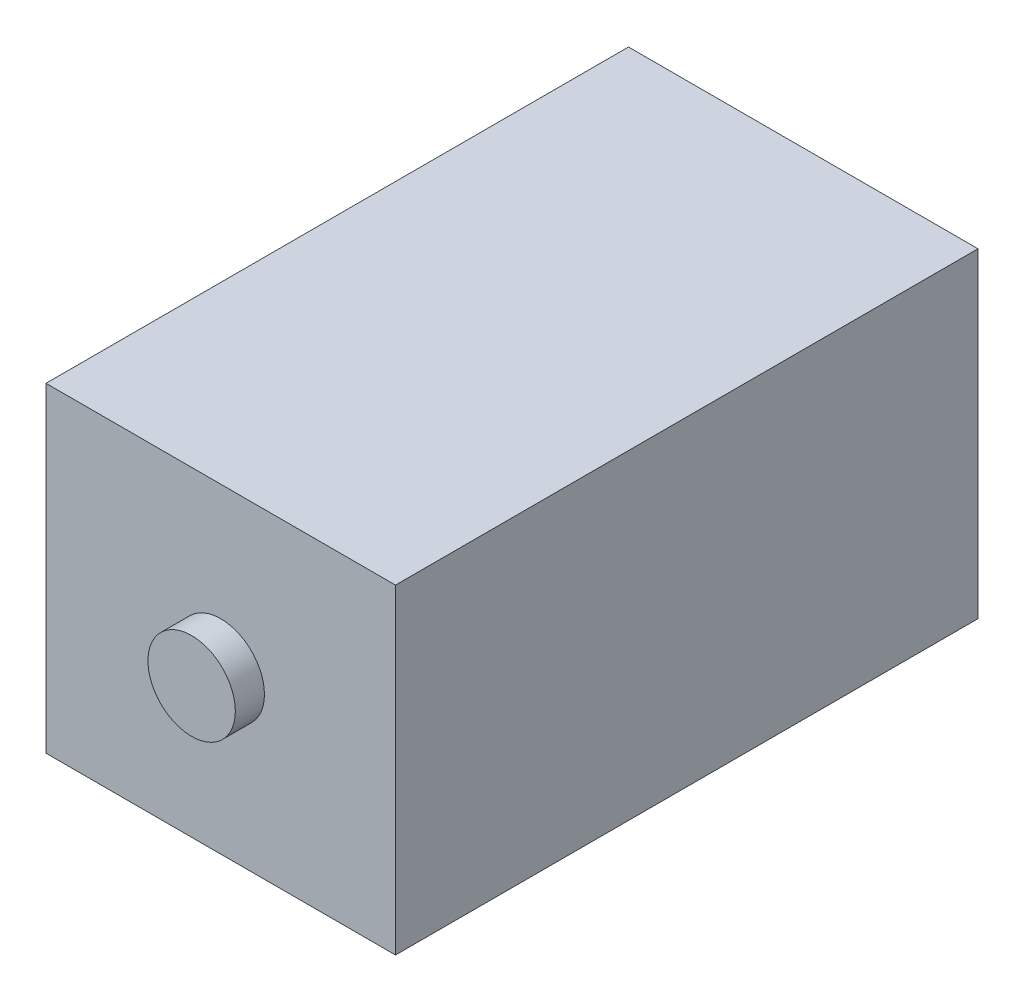
ISO-10303-21;
HEADER;
FILE_DESCRIPTION(('STEP AP214'),'2;1');
FILE_NAME('part.step','',(''),(''),'','','');
FILE_SCHEMA(('AUTOMOTIVE_DESIGN { 1 0 10303 214 1 1 1 1 }'));
ENDSEC;
DATA;
#1=APPLICATION_CONTEXT('core data for automotive mechanical design processes');
#2=APPLICATION_PROTOCOL_DEFINITION('international standard','automotive_design',2000,#1);
#3=PRODUCT_CONTEXT('',#1,'mechanical');
#4=PRODUCT('Part','Part','',(#3));
#5=PRODUCT_RELATED_PRODUCT_CATEGORY('part','',(#4));
#6=PRODUCT_DEFINITION_FORMATION('','',#4);
#7=PRODUCT_DEFINITION_CONTEXT('part definition',#1,'design');
#8=PRODUCT_DEFINITION('design','',#6,#7);
#9=PRODUCT_DEFINITION_SHAPE('','',#8);
#10=(LENGTH_UNIT() NAMED_UNIT(*) SI_UNIT(.MILLI.,.METRE.));
#11=(NAMED_UNIT(*) PLANE_ANGLE_UNIT() SI_UNIT($,.RADIAN.));
#12=(NAMED_UNIT(*) SI_UNIT($,.STERADIAN.) SOLID_ANGLE_UNIT());
#13=UNCERTAINTY_MEASURE_WITH_UNIT(LENGTH_MEASURE(1.E-05),#10,'distance_accuracy_value','');
#14=(GEOMETRIC_REPRESENTATION_CONTEXT(3) GLOBAL_UNCERTAINTY_ASSIGNED_CONTEXT((#13)) GLOBAL_UNIT_ASSIGNED_CONTEXT((#10,
#11,#12)) REPRESENTATION_CONTEXT('',''));
#15=CARTESIAN_POINT('',(0.,0.,0.));
#16=DIRECTION('',(0.,0.,1.));
#17=DIRECTION('',(1.,0.,0.));
#18=AXIS2_PLACEMENT_3D('',#15,#16,#17);
#19=CARTESIAN_POINT('',(-6.,5.5,20.));
#20=DIRECTION('',(1.,0.,0.));
#21=DIRECTION('',(0.,1.,0.));
#22=AXIS2_PLACEMENT_3D('',#19,#20,#21);
#23=PLANE('',#22);
#24=DIRECTION('',(0.,-1.,0.));
#25=VECTOR('',#24,1.);
#26=CARTESIAN_POINT('',(-6.,5.5,0.));
#27=LINE('',#26,#25);
#28=CARTESIAN_POINT('',(-6.,5.5,0.));
#29=VERTEX_POINT('',#28);
#30=CARTESIAN_POINT('',(-6.,-5.5,0.));
#31=VERTEX_POINT('',#30);
#32=EDGE_CURVE('E99',#29,#31,#27,.T.);
#33=ORIENTED_EDGE('',*,*,#32,.T.);
#34=DIRECTION('',(0.,0.,-1.));
#35=VECTOR('',#34,1.);
#36=CARTESIAN_POINT('',(-6.,-5.5,20.));
#37=LINE('',#36,#35);
#38=CARTESIAN_POINT('',(-6.,-5.5,20.));
#39=VERTEX_POINT('',#38);
#40=EDGE_CURVE('E36',#39,#31,#37,.T.);
#41=ORIENTED_EDGE('',*,*,#40,.F.);
#42=DIRECTION('',(0.,-1.,0.));
#43=VECTOR('',#42,1.);
#44=CARTESIAN_POINT('',(-6.,5.5,20.));
#45=LINE('',#44,#43);
#46=CARTESIAN_POINT('',(-6.,5.5,20.));
#47=VERTEX_POINT('',#46);
#48=EDGE_CURVE('E86',#47,#39,#45,.T.);
#49=ORIENTED_EDGE('',*,*,#48,.F.);
#50=DIRECTION('',(0.,0.,-1.));
#51=VECTOR('',#50,1.);
#52=CARTESIAN_POINT('',(-6.,5.5,20.));
#53=LINE('',#52,#51);
#54=EDGE_CURVE('E95',#47,#29,#53,.T.);
#55=ORIENTED_EDGE('',*,*,#54,.T.);
#56=EDGE_LOOP('',(#33,#41,#49,#55));
#57=FACE_BOUND('',#56,.T.);
#58=ADVANCED_FACE('F33',(#57),#23,.F.);
#59=CARTESIAN_POINT('',(6.,-5.5,20.));
#60=DIRECTION('',(0.,1.,0.));
#61=DIRECTION('',(-1.,0.,0.));
#62=AXIS2_PLACEMENT_3D('',#59,#60,#61);
#63=PLANE('',#62);
#64=DIRECTION('',(1.,0.,0.));
#65=VECTOR('',#64,1.);
#66=CARTESIAN_POINT('',(6.,-5.5,0.));
#67=LINE('',#66,#65);
#68=CARTESIAN_POINT('',(6.,-5.5,0.));
#69=VERTEX_POINT('',#68);
#70=EDGE_CURVE('E91',#31,#69,#67,.T.);
#71=ORIENTED_EDGE('',*,*,#70,.T.);
#72=DIRECTION('',(0.,0.,-1.));
#73=VECTOR('',#72,1.);
#74=CARTESIAN_POINT('',(6.,-5.5,20.));
#75=LINE('',#74,#73);
#76=CARTESIAN_POINT('',(6.,-5.5,20.));
#77=VERTEX_POINT('',#76);
#78=EDGE_CURVE('E89',#77,#69,#75,.T.);
#79=ORIENTED_EDGE('',*,*,#78,.F.);
#80=DIRECTION('',(1.,0.,0.));
#81=VECTOR('',#80,1.);
#82=CARTESIAN_POINT('',(6.,-5.5,20.));
#83=LINE('',#82,#81);
#84=EDGE_CURVE('E81',#39,#77,#83,.T.);
#85=ORIENTED_EDGE('',*,*,#84,.F.);
#86=ORIENTED_EDGE('',*,*,#40,.T.);
#87=EDGE_LOOP('',(#71,#79,#85,#86));
#88=FACE_BOUND('',#87,.T.);
#89=ADVANCED_FACE('F90',(#88),#63,.F.);
#90=CARTESIAN_POINT('',(6.,5.5,20.));
#91=DIRECTION('',(-1.,0.,0.));
#92=DIRECTION('',(0.,-1.,0.));
#93=AXIS2_PLACEMENT_3D('',#90,#91,#92);
#94=PLANE('',#93);
#95=DIRECTION('',(0.,1.,0.));
#96=VECTOR('',#95,1.);
#97=CARTESIAN_POINT('',(6.,5.5,0.));
#98=LINE('',#97,#96);
#99=CARTESIAN_POINT('',(6.,5.5,0.));
#100=VERTEX_POINT('',#99);
#101=EDGE_CURVE('E67',#69,#100,#98,.T.);
#102=ORIENTED_EDGE('',*,*,#101,.T.);
#103=DIRECTION('',(0.,0.,-1.));
#104=VECTOR('',#103,1.);
#105=CARTESIAN_POINT('',(6.,5.5,20.));
#106=LINE('',#105,#104);
#107=CARTESIAN_POINT('',(6.,5.5,20.));
#108=VERTEX_POINT('',#107);
#109=EDGE_CURVE('E92',#108,#100,#106,.T.);
#110=ORIENTED_EDGE('',*,*,#109,.F.);
#111=DIRECTION('',(0.,1.,0.));
#112=VECTOR('',#111,1.);
#113=CARTESIAN_POINT('',(6.,5.5,20.));
#114=LINE('',#113,#112);
#115=EDGE_CURVE('E84',#77,#108,#114,.T.);
#116=ORIENTED_EDGE('',*,*,#115,.F.);
#117=ORIENTED_EDGE('',*,*,#78,.T.);
#118=EDGE_LOOP('',(#102,#110,#116,#117));
#119=FACE_BOUND('',#118,.T.);
#120=ADVANCED_FACE('F93',(#119),#94,.F.);
#121=CARTESIAN_POINT('',(6.,5.5,20.));
#122=DIRECTION('',(0.,-1.,0.));
#123=DIRECTION('',(1.,0.,0.));
#124=AXIS2_PLACEMENT_3D('',#121,#122,#123);
#125=PLANE('',#124);
#126=DIRECTION('',(-1.,0.,0.));
#127=VECTOR('',#126,1.);
#128=CARTESIAN_POINT('',(6.,5.5,0.));
#129=LINE('',#128,#127);
#130=EDGE_CURVE('E73',#100,#29,#129,.T.);
#131=ORIENTED_EDGE('',*,*,#130,.T.);
#132=ORIENTED_EDGE('',*,*,#54,.F.);
#133=DIRECTION('',(-1.,0.,0.));
#134=VECTOR('',#133,1.);
#135=CARTESIAN_POINT('',(6.,5.5,20.));
#136=LINE('',#135,#134);
#137=EDGE_CURVE('E50',#108,#47,#136,.T.);
#138=ORIENTED_EDGE('',*,*,#137,.F.);
#139=ORIENTED_EDGE('',*,*,#109,.T.);
#140=EDGE_LOOP('',(#131,#132,#138,#139));
#141=FACE_BOUND('',#140,.T.);
#142=ADVANCED_FACE('F107',(#141),#125,.F.);
#143=CARTESIAN_POINT('',(0.,0.,20.));
#144=DIRECTION('',(0.,0.,-1.));
#145=DIRECTION('',(-1.,0.,0.));
#146=AXIS2_PLACEMENT_3D('',#143,#144,#145);
#147=PLANE('',#146);
#148=CARTESIAN_POINT('',(0.,0.,20.));
#149=DIRECTION('',(0.,0.,1.));
#150=DIRECTION('',(1.,0.,0.));
#151=AXIS2_PLACEMENT_3D('',#148,#149,#150);
#152=CIRCLE('',#151,1.5);
#153=CARTESIAN_POINT('',(1.5,0.,20.));
#154=VERTEX_POINT('',#153);
#155=EDGE_CURVE('E11',#154,#154,#152,.T.);
#156=ORIENTED_EDGE('',*,*,#155,.F.);
#157=EDGE_LOOP('',(#156));
#158=FACE_BOUND('',#157,.T.);
#159=ORIENTED_EDGE('',*,*,#48,.T.);
#160=ORIENTED_EDGE('',*,*,#84,.T.);
#161=ORIENTED_EDGE('',*,*,#115,.T.);
#162=ORIENTED_EDGE('',*,*,#137,.T.);
#163=EDGE_LOOP('',(#159,#160,#161,#162));
#164=FACE_BOUND('',#163,.T.);
#165=ADVANCED_FACE('F82',(#158,#164),#147,.F.);
#166=CARTESIAN_POINT('',(0.,0.,0.));
#167=DIRECTION('',(0.,0.,-1.));
#168=DIRECTION('',(-1.,0.,0.));
#169=AXIS2_PLACEMENT_3D('',#166,#167,#168);
#170=PLANE('',#169);
#171=ORIENTED_EDGE('',*,*,#32,.F.);
#172=ORIENTED_EDGE('',*,*,#130,.F.);
#173=ORIENTED_EDGE('',*,*,#101,.F.);
#174=ORIENTED_EDGE('',*,*,#70,.F.);
#175=EDGE_LOOP('',(#171,#172,#173,#174));
#176=FACE_BOUND('',#175,.T.);
#177=ADVANCED_FACE('F110',(#176),#170,.T.);
#178=CARTESIAN_POINT('',(0.,0.,21.));
#179=DIRECTION('',(0.,0.,-1.));
#180=DIRECTION('',(-1.,0.,0.));
#181=AXIS2_PLACEMENT_3D('',#178,#179,#180);
#182=CYLINDRICAL_SURFACE('',#181,1.5);
#183=CARTESIAN_POINT('',(0.,0.,21.));
#184=DIRECTION('',(0.,0.,1.));
#185=DIRECTION('',(1.,0.,0.));
#186=AXIS2_PLACEMENT_3D('',#183,#184,#185);
#187=CIRCLE('',#186,1.5);
#188=CARTESIAN_POINT('',(1.5,0.,21.));
#189=VERTEX_POINT('',#188);
#190=EDGE_CURVE('E102',#189,#189,#187,.T.);
#191=ORIENTED_EDGE('',*,*,#190,.F.);
#192=EDGE_LOOP('',(#191));
#193=FACE_BOUND('',#192,.T.);
#194=ORIENTED_EDGE('',*,*,#155,.T.);
#195=EDGE_LOOP('',(#194));
#196=FACE_BOUND('',#195,.T.);
#197=ADVANCED_FACE('F118',(#193,#196),#182,.T.);
#198=CARTESIAN_POINT('',(0.,0.,21.));
#199=DIRECTION('',(0.,0.,1.));
#200=DIRECTION('',(1.,0.,0.));
#201=AXIS2_PLACEMENT_3D('',#198,#199,#200);
#202=PLANE('',#201);
#203=ORIENTED_EDGE('',*,*,#190,.T.);
#204=EDGE_LOOP('',(#203));
#205=FACE_BOUND('',#204,.T.);
#206=ADVANCED_FACE('F116',(#205),#202,.T.);
#207=CLOSED_SHELL('',(#58,#89,#120,#142,#165,#177,#197,#206));
#208=MANIFOLD_SOLID_BREP('B2',#207);
#209=ADVANCED_BREP_SHAPE_REPRESENTATION('',(#18,#208),#14);
#210=SHAPE_DEFINITION_REPRESENTATION(#9,#209);
ENDSEC;
END-ISO-10303-21;
